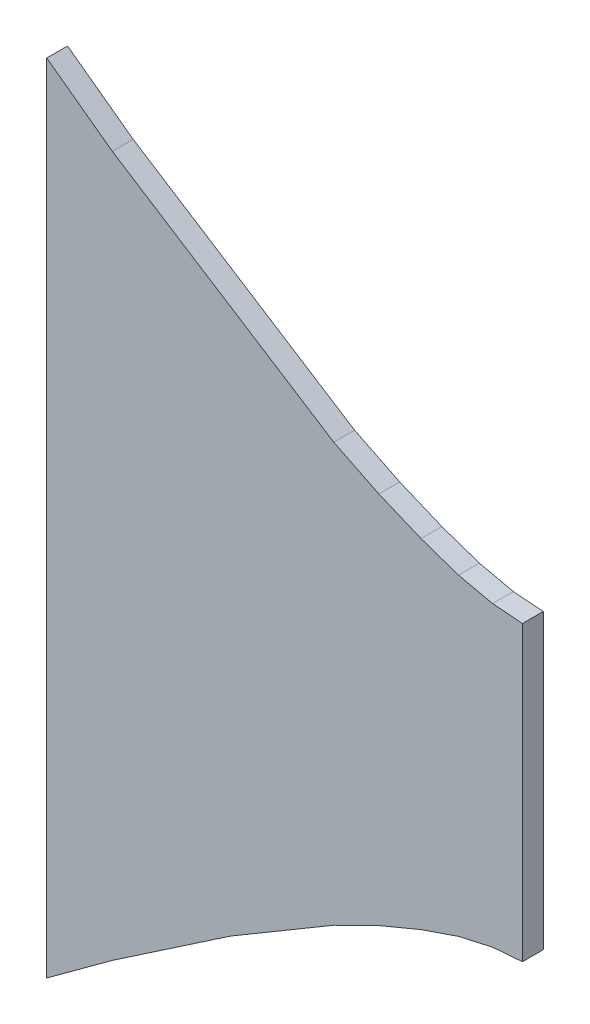
ISO-10303-21;
HEADER;
FILE_DESCRIPTION(('STEP AP214'),'2;1');
FILE_NAME('part.step','',(''),(''),'','','');
FILE_SCHEMA(('AUTOMOTIVE_DESIGN { 1 0 10303 214 1 1 1 1 }'));
ENDSEC;
DATA;
#1=APPLICATION_CONTEXT('core data for automotive mechanical design processes');
#2=APPLICATION_PROTOCOL_DEFINITION('international standard','automotive_design',2000,#1);
#3=PRODUCT_CONTEXT('',#1,'mechanical');
#4=PRODUCT('Part','Part','',(#3));
#5=PRODUCT_RELATED_PRODUCT_CATEGORY('part','',(#4));
#6=PRODUCT_DEFINITION_FORMATION('','',#4);
#7=PRODUCT_DEFINITION_CONTEXT('part definition',#1,'design');
#8=PRODUCT_DEFINITION('design','',#6,#7);
#9=PRODUCT_DEFINITION_SHAPE('','',#8);
#10=(LENGTH_UNIT() NAMED_UNIT(*) SI_UNIT(.MILLI.,.METRE.));
#11=(NAMED_UNIT(*) PLANE_ANGLE_UNIT() SI_UNIT($,.RADIAN.));
#12=(NAMED_UNIT(*) SI_UNIT($,.STERADIAN.) SOLID_ANGLE_UNIT());
#13=UNCERTAINTY_MEASURE_WITH_UNIT(LENGTH_MEASURE(1.E-05),#10,'distance_accuracy_value','');
#14=(GEOMETRIC_REPRESENTATION_CONTEXT(3) GLOBAL_UNCERTAINTY_ASSIGNED_CONTEXT((#13)) GLOBAL_UNIT_ASSIGNED_CONTEXT((#10,
#11,#12)) REPRESENTATION_CONTEXT('',''));
#15=CARTESIAN_POINT('',(0.,0.,0.));
#16=DIRECTION('',(0.,0.,1.));
#17=DIRECTION('',(1.,0.,0.));
#18=AXIS2_PLACEMENT_3D('',#15,#16,#17);
#19=CARTESIAN_POINT('',(82.681999206543,117.25,0.));
#20=DIRECTION('',(-0.0781447450221444,-0.996942023803503,0.));
#21=DIRECTION('',(-0.996942023803503,0.0781447450221444,0.));
#22=AXIS2_PLACEMENT_3D('',#19,#20,#21);
#23=PLANE('',#22);
#24=DIRECTION('',(-0.996942023803503,0.0781447450221444,0.));
#25=VECTOR('',#24,1.);
#26=CARTESIAN_POINT('',(82.681999206543,117.25,0.03556));
#27=LINE('',#26,#25);
#28=CARTESIAN_POINT('',(82.681999206543,117.25,0.03556));
#29=VERTEX_POINT('',#28);
#30=CARTESIAN_POINT('',(82.6309967041016,117.253997802734,0.03556));
#31=VERTEX_POINT('',#30);
#32=EDGE_CURVE('E11',#29,#31,#27,.T.);
#33=ORIENTED_EDGE('',*,*,#32,.F.);
#34=DIRECTION('',(0.,0.,1.));
#35=VECTOR('',#34,1.);
#36=CARTESIAN_POINT('',(82.681999206543,117.25,0.));
#37=LINE('',#36,#35);
#38=CARTESIAN_POINT('',(82.681999206543,117.25,0.));
#39=VERTEX_POINT('',#38);
#40=EDGE_CURVE('E24',#39,#29,#37,.T.);
#41=ORIENTED_EDGE('',*,*,#40,.F.);
#42=DIRECTION('',(-0.996942023803503,0.0781447450221444,0.));
#43=VECTOR('',#42,1.);
#44=CARTESIAN_POINT('',(82.681999206543,117.25,0.));
#45=LINE('',#44,#43);
#46=CARTESIAN_POINT('',(82.6309967041016,117.253997802734,0.));
#47=VERTEX_POINT('',#46);
#48=EDGE_CURVE('E154',#39,#47,#45,.T.);
#49=ORIENTED_EDGE('',*,*,#48,.T.);
#50=DIRECTION('',(0.,0.,1.));
#51=VECTOR('',#50,1.);
#52=CARTESIAN_POINT('',(82.6309967041016,117.253997802734,0.));
#53=LINE('',#52,#51);
#54=EDGE_CURVE('E37',#47,#31,#53,.T.);
#55=ORIENTED_EDGE('',*,*,#54,.T.);
#56=EDGE_LOOP('',(#33,#41,#49,#55));
#57=FACE_BOUND('',#56,.T.);
#58=ADVANCED_FACE('F17',(#57),#23,.F.);
#59=CARTESIAN_POINT('',(82.6309967041016,117.253997802734,0.));
#60=DIRECTION('',(-0.218724100263412,-0.97578674307656,0.));
#61=DIRECTION('',(-0.97578674307656,0.218724100263412,0.));
#62=AXIS2_PLACEMENT_3D('',#59,#60,#61);
#63=PLANE('',#62);
#64=DIRECTION('',(-0.97578674307656,0.218724100263412,0.));
#65=VECTOR('',#64,1.);
#66=CARTESIAN_POINT('',(82.6309967041016,117.253997802734,0.03556));
#67=LINE('',#66,#65);
#68=CARTESIAN_POINT('',(82.572998046875,117.266998291016,0.03556));
#69=VERTEX_POINT('',#68);
#70=EDGE_CURVE('E266',#31,#69,#67,.T.);
#71=ORIENTED_EDGE('',*,*,#70,.F.);
#72=ORIENTED_EDGE('',*,*,#54,.F.);
#73=DIRECTION('',(-0.97578674307656,0.218724100263412,0.));
#74=VECTOR('',#73,1.);
#75=CARTESIAN_POINT('',(82.6309967041016,117.253997802734,0.));
#76=LINE('',#75,#74);
#77=CARTESIAN_POINT('',(82.572998046875,117.266998291016,0.));
#78=VERTEX_POINT('',#77);
#79=EDGE_CURVE('E263',#47,#78,#76,.T.);
#80=ORIENTED_EDGE('',*,*,#79,.T.);
#81=DIRECTION('',(0.,0.,1.));
#82=VECTOR('',#81,1.);
#83=CARTESIAN_POINT('',(82.572998046875,117.266998291016,0.));
#84=LINE('',#83,#82);
#85=EDGE_CURVE('E261',#78,#69,#84,.T.);
#86=ORIENTED_EDGE('',*,*,#85,.T.);
#87=EDGE_LOOP('',(#71,#72,#80,#86));
#88=FACE_BOUND('',#87,.T.);
#89=ADVANCED_FACE('F274',(#88),#63,.F.);
#90=CARTESIAN_POINT('',(82.572998046875,117.266998291016,0.));
#91=DIRECTION('',(-0.325142784154832,-0.945664935329657,0.));
#92=DIRECTION('',(-0.945664935329657,0.325142784154832,0.));
#93=AXIS2_PLACEMENT_3D('',#90,#91,#92);
#94=PLANE('',#93);
#95=DIRECTION('',(-0.945664935329657,0.325142784154832,0.));
#96=VECTOR('',#95,1.);
#97=CARTESIAN_POINT('',(82.572998046875,117.266998291016,0.03556));
#98=LINE('',#97,#96);
#99=CARTESIAN_POINT('',(82.5090026855469,117.289001464844,0.03556));
#100=VERTEX_POINT('',#99);
#101=EDGE_CURVE('E258',#69,#100,#98,.T.);
#102=ORIENTED_EDGE('',*,*,#101,.F.);
#103=ORIENTED_EDGE('',*,*,#85,.F.);
#104=DIRECTION('',(-0.945664935329657,0.325142784154832,0.));
#105=VECTOR('',#104,1.);
#106=CARTESIAN_POINT('',(82.572998046875,117.266998291016,0.));
#107=LINE('',#106,#105);
#108=CARTESIAN_POINT('',(82.5090026855469,117.289001464844,0.));
#109=VERTEX_POINT('',#108);
#110=EDGE_CURVE('E255',#78,#109,#107,.T.);
#111=ORIENTED_EDGE('',*,*,#110,.T.);
#112=DIRECTION('',(0.,0.,1.));
#113=VECTOR('',#112,1.);
#114=CARTESIAN_POINT('',(82.5090026855469,117.289001464844,0.));
#115=LINE('',#114,#113);
#116=EDGE_CURVE('E253',#109,#100,#115,.T.);
#117=ORIENTED_EDGE('',*,*,#116,.T.);
#118=EDGE_LOOP('',(#102,#103,#111,#117));
#119=FACE_BOUND('',#118,.T.);
#120=ADVANCED_FACE('F280',(#119),#94,.F.);
#121=CARTESIAN_POINT('',(82.5090026855469,117.289001464844,0.));
#122=DIRECTION('',(-0.384573715338406,-0.923094284171891,0.));
#123=DIRECTION('',(-0.923094284171891,0.384573715338406,0.));
#124=AXIS2_PLACEMENT_3D('',#121,#122,#123);
#125=PLANE('',#124);
#126=DIRECTION('',(-0.923094284171891,0.384573715338406,0.));
#127=VECTOR('',#126,1.);
#128=CARTESIAN_POINT('',(82.5090026855469,117.289001464844,0.03556));
#129=LINE('',#128,#127);
#130=CARTESIAN_POINT('',(82.4369964599609,117.319000244141,0.03556));
#131=VERTEX_POINT('',#130);
#132=EDGE_CURVE('E250',#100,#131,#129,.T.);
#133=ORIENTED_EDGE('',*,*,#132,.F.);
#134=ORIENTED_EDGE('',*,*,#116,.F.);
#135=DIRECTION('',(-0.923094284171891,0.384573715338406,0.));
#136=VECTOR('',#135,1.);
#137=CARTESIAN_POINT('',(82.5090026855469,117.289001464844,0.));
#138=LINE('',#137,#136);
#139=CARTESIAN_POINT('',(82.4369964599609,117.319000244141,0.));
#140=VERTEX_POINT('',#139);
#141=EDGE_CURVE('E247',#109,#140,#138,.T.);
#142=ORIENTED_EDGE('',*,*,#141,.T.);
#143=DIRECTION('',(0.,0.,1.));
#144=VECTOR('',#143,1.);
#145=CARTESIAN_POINT('',(82.4369964599609,117.319000244141,0.));
#146=LINE('',#145,#144);
#147=EDGE_CURVE('E245',#140,#131,#146,.T.);
#148=ORIENTED_EDGE('',*,*,#147,.T.);
#149=EDGE_LOOP('',(#133,#134,#142,#148));
#150=FACE_BOUND('',#149,.T.);
#151=ADVANCED_FACE('F282',(#150),#125,.F.);
#152=CARTESIAN_POINT('',(82.4369964599609,117.319000244141,0.));
#153=DIRECTION('',(-0.442587164049526,-0.896725488774908,0.));
#154=DIRECTION('',(-0.896725488774908,0.442587164049526,0.));
#155=AXIS2_PLACEMENT_3D('',#152,#153,#154);
#156=PLANE('',#155);
#157=DIRECTION('',(-0.896725488774908,0.442587164049526,0.));
#158=VECTOR('',#157,1.);
#159=CARTESIAN_POINT('',(82.4369964599609,117.319000244141,0.03556));
#160=LINE('',#159,#158);
#161=CARTESIAN_POINT('',(82.3600006103516,117.357002258301,0.03556));
#162=VERTEX_POINT('',#161);
#163=EDGE_CURVE('E242',#131,#162,#160,.T.);
#164=ORIENTED_EDGE('',*,*,#163,.F.);
#165=ORIENTED_EDGE('',*,*,#147,.F.);
#166=DIRECTION('',(-0.896725488774908,0.442587164049526,0.));
#167=VECTOR('',#166,1.);
#168=CARTESIAN_POINT('',(82.4369964599609,117.319000244141,0.));
#169=LINE('',#168,#167);
#170=CARTESIAN_POINT('',(82.3600006103516,117.357002258301,0.));
#171=VERTEX_POINT('',#170);
#172=EDGE_CURVE('E239',#140,#171,#169,.T.);
#173=ORIENTED_EDGE('',*,*,#172,.T.);
#174=DIRECTION('',(0.,0.,1.));
#175=VECTOR('',#174,1.);
#176=CARTESIAN_POINT('',(82.3600006103516,117.357002258301,0.));
#177=LINE('',#176,#175);
#178=EDGE_CURVE('E237',#171,#162,#177,.T.);
#179=ORIENTED_EDGE('',*,*,#178,.T.);
#180=EDGE_LOOP('',(#164,#165,#173,#179));
#181=FACE_BOUND('',#180,.T.);
#182=ADVANCED_FACE('F287',(#181),#156,.F.);
#183=CARTESIAN_POINT('',(82.3600006103516,117.357002258301,0.));
#184=DIRECTION('',(-0.537594397602345,-0.843203571900981,0.));
#185=DIRECTION('',(-0.843203571900981,0.537594397602345,0.));
#186=AXIS2_PLACEMENT_3D('',#183,#184,#185);
#187=PLANE('',#186);
#188=DIRECTION('',(-0.843203571900981,0.537594397602345,0.));
#189=VECTOR('',#188,1.);
#190=CARTESIAN_POINT('',(82.3600006103516,117.357002258301,0.03556));
#191=LINE('',#190,#189);
#192=CARTESIAN_POINT('',(81.9820022583008,117.597999572754,0.03556));
#193=VERTEX_POINT('',#192);
#194=EDGE_CURVE('E234',#162,#193,#191,.T.);
#195=ORIENTED_EDGE('',*,*,#194,.F.);
#196=ORIENTED_EDGE('',*,*,#178,.F.);
#197=DIRECTION('',(-0.843203571900981,0.537594397602345,0.));
#198=VECTOR('',#197,1.);
#199=CARTESIAN_POINT('',(82.3600006103516,117.357002258301,0.));
#200=LINE('',#199,#198);
#201=CARTESIAN_POINT('',(81.9820022583008,117.597999572754,0.));
#202=VERTEX_POINT('',#201);
#203=EDGE_CURVE('E231',#171,#202,#200,.T.);
#204=ORIENTED_EDGE('',*,*,#203,.T.);
#205=DIRECTION('',(0.,0.,1.));
#206=VECTOR('',#205,1.);
#207=CARTESIAN_POINT('',(81.9820022583008,117.597999572754,0.));
#208=LINE('',#207,#206);
#209=EDGE_CURVE('E229',#202,#193,#208,.T.);
#210=ORIENTED_EDGE('',*,*,#209,.T.);
#211=EDGE_LOOP('',(#195,#196,#204,#210));
#212=FACE_BOUND('',#211,.T.);
#213=ADVANCED_FACE('F290',(#212),#187,.F.);
#214=CARTESIAN_POINT('',(81.9820022583008,117.597999572754,0.));
#215=DIRECTION('',(-0.590743962247607,-0.806859077576746,0.));
#216=DIRECTION('',(-0.806859077576746,0.590743962247607,0.));
#217=AXIS2_PLACEMENT_3D('',#214,#215,#216);
#218=PLANE('',#217);
#219=DIRECTION('',(-0.806859077576746,0.590743962247607,0.));
#220=VECTOR('',#219,1.);
#221=CARTESIAN_POINT('',(81.9820022583008,117.597999572754,0.03556));
#222=LINE('',#221,#220);
#223=CARTESIAN_POINT('',(81.870002746582,117.680000305176,0.03556));
#224=VERTEX_POINT('',#223);
#225=EDGE_CURVE('E226',#193,#224,#222,.T.);
#226=ORIENTED_EDGE('',*,*,#225,.F.);
#227=ORIENTED_EDGE('',*,*,#209,.F.);
#228=DIRECTION('',(-0.806859077576746,0.590743962247607,0.));
#229=VECTOR('',#228,1.);
#230=CARTESIAN_POINT('',(81.9820022583008,117.597999572754,0.));
#231=LINE('',#230,#229);
#232=CARTESIAN_POINT('',(81.870002746582,117.680000305176,0.));
#233=VERTEX_POINT('',#232);
#234=EDGE_CURVE('E223',#202,#233,#231,.T.);
#235=ORIENTED_EDGE('',*,*,#234,.T.);
#236=DIRECTION('',(0.,0.,1.));
#237=VECTOR('',#236,1.);
#238=CARTESIAN_POINT('',(81.870002746582,117.680000305176,0.));
#239=LINE('',#238,#237);
#240=EDGE_CURVE('E221',#233,#224,#239,.T.);
#241=ORIENTED_EDGE('',*,*,#240,.T.);
#242=EDGE_LOOP('',(#226,#227,#235,#241));
#243=FACE_BOUND('',#242,.T.);
#244=ADVANCED_FACE('F295',(#243),#218,.F.);
#245=CARTESIAN_POINT('',(81.870002746582,117.680000305176,0.));
#246=DIRECTION('',(1.,0.,0.));
#247=DIRECTION('',(0.,-1.,0.));
#248=AXIS2_PLACEMENT_3D('',#245,#246,#247);
#249=PLANE('',#248);
#250=DIRECTION('',(0.,-1.,0.));
#251=VECTOR('',#250,1.);
#252=CARTESIAN_POINT('',(81.870002746582,117.680000305176,0.03556));
#253=LINE('',#252,#251);
#254=CARTESIAN_POINT('',(81.870002746582,116.319999694824,0.03556));
#255=VERTEX_POINT('',#254);
#256=EDGE_CURVE('E218',#224,#255,#253,.T.);
#257=ORIENTED_EDGE('',*,*,#256,.F.);
#258=ORIENTED_EDGE('',*,*,#240,.F.);
#259=DIRECTION('',(0.,-1.,0.));
#260=VECTOR('',#259,1.);
#261=CARTESIAN_POINT('',(81.870002746582,117.680000305176,0.));
#262=LINE('',#261,#260);
#263=CARTESIAN_POINT('',(81.870002746582,116.319999694824,0.));
#264=VERTEX_POINT('',#263);
#265=EDGE_CURVE('E215',#233,#264,#262,.T.);
#266=ORIENTED_EDGE('',*,*,#265,.T.);
#267=DIRECTION('',(0.,0.,1.));
#268=VECTOR('',#267,1.);
#269=CARTESIAN_POINT('',(81.870002746582,116.319999694824,0.));
#270=LINE('',#269,#268);
#271=EDGE_CURVE('E213',#264,#255,#270,.T.);
#272=ORIENTED_EDGE('',*,*,#271,.T.);
#273=EDGE_LOOP('',(#257,#258,#266,#272));
#274=FACE_BOUND('',#273,.T.);
#275=ADVANCED_FACE('F298',(#274),#249,.F.);
#276=CARTESIAN_POINT('',(81.870002746582,116.319999694824,0.));
#277=DIRECTION('',(-0.590743962247607,0.806859077576746,0.));
#278=DIRECTION('',(0.806859077576746,0.590743962247607,0.));
#279=AXIS2_PLACEMENT_3D('',#276,#277,#278);
#280=PLANE('',#279);
#281=DIRECTION('',(0.806859077576746,0.590743962247607,0.));
#282=VECTOR('',#281,1.);
#283=CARTESIAN_POINT('',(81.870002746582,116.319999694824,0.03556));
#284=LINE('',#283,#282);
#285=CARTESIAN_POINT('',(81.9820022583008,116.402000427246,0.03556));
#286=VERTEX_POINT('',#285);
#287=EDGE_CURVE('E210',#255,#286,#284,.T.);
#288=ORIENTED_EDGE('',*,*,#287,.F.);
#289=ORIENTED_EDGE('',*,*,#271,.F.);
#290=DIRECTION('',(0.806859077576746,0.590743962247607,0.));
#291=VECTOR('',#290,1.);
#292=CARTESIAN_POINT('',(81.870002746582,116.319999694824,0.));
#293=LINE('',#292,#291);
#294=CARTESIAN_POINT('',(81.9820022583008,116.402000427246,0.));
#295=VERTEX_POINT('',#294);
#296=EDGE_CURVE('E207',#264,#295,#293,.T.);
#297=ORIENTED_EDGE('',*,*,#296,.T.);
#298=DIRECTION('',(0.,0.,1.));
#299=VECTOR('',#298,1.);
#300=CARTESIAN_POINT('',(81.9820022583008,116.402000427246,0.));
#301=LINE('',#300,#299);
#302=EDGE_CURVE('E205',#295,#286,#301,.T.);
#303=ORIENTED_EDGE('',*,*,#302,.T.);
#304=EDGE_LOOP('',(#288,#289,#297,#303));
#305=FACE_BOUND('',#304,.T.);
#306=ADVANCED_FACE('F303',(#305),#280,.F.);
#307=CARTESIAN_POINT('',(81.9820022583008,116.402000427246,0.));
#308=DIRECTION('',(-0.561311831406684,0.827604390951905,0.));
#309=DIRECTION('',(0.827604390951905,0.561311831406684,0.));
#310=AXIS2_PLACEMENT_3D('',#307,#308,#309);
#311=PLANE('',#310);
#312=DIRECTION('',(0.827604390951905,0.561311831406684,0.));
#313=VECTOR('',#312,1.);
#314=CARTESIAN_POINT('',(81.9820022583008,116.402000427246,0.03556));
#315=LINE('',#314,#313);
#316=CARTESIAN_POINT('',(82.1839981079102,116.539001464844,0.03556));
#317=VERTEX_POINT('',#316);
#318=EDGE_CURVE('E202',#286,#317,#315,.T.);
#319=ORIENTED_EDGE('',*,*,#318,.F.);
#320=ORIENTED_EDGE('',*,*,#302,.F.);
#321=DIRECTION('',(0.827604390951905,0.561311831406684,0.));
#322=VECTOR('',#321,1.);
#323=CARTESIAN_POINT('',(81.9820022583008,116.402000427246,0.));
#324=LINE('',#323,#322);
#325=CARTESIAN_POINT('',(82.1839981079102,116.539001464844,0.));
#326=VERTEX_POINT('',#325);
#327=EDGE_CURVE('E199',#295,#326,#324,.T.);
#328=ORIENTED_EDGE('',*,*,#327,.T.);
#329=DIRECTION('',(0.,0.,1.));
#330=VECTOR('',#329,1.);
#331=CARTESIAN_POINT('',(82.1839981079102,116.539001464844,0.));
#332=LINE('',#331,#330);
#333=EDGE_CURVE('E197',#326,#317,#332,.T.);
#334=ORIENTED_EDGE('',*,*,#333,.T.);
#335=EDGE_LOOP('',(#319,#320,#328,#334));
#336=FACE_BOUND('',#335,.T.);
#337=ADVANCED_FACE('F306',(#336),#311,.F.);
#338=CARTESIAN_POINT('',(82.1839981079102,116.539001464844,0.));
#339=DIRECTION('',(-0.508710451917148,0.860937672604848,0.));
#340=DIRECTION('',(0.860937672604848,0.508710451917148,0.));
#341=AXIS2_PLACEMENT_3D('',#338,#339,#340);
#342=PLANE('',#341);
#343=DIRECTION('',(0.860937672604848,0.508710451917148,0.));
#344=VECTOR('',#343,1.);
#345=CARTESIAN_POINT('',(82.1839981079102,116.539001464844,0.03556));
#346=LINE('',#345,#344);
#347=CARTESIAN_POINT('',(82.3600006103516,116.642997741699,0.03556));
#348=VERTEX_POINT('',#347);
#349=EDGE_CURVE('E194',#317,#348,#346,.T.);
#350=ORIENTED_EDGE('',*,*,#349,.F.);
#351=ORIENTED_EDGE('',*,*,#333,.F.);
#352=DIRECTION('',(0.860937672604848,0.508710451917148,0.));
#353=VECTOR('',#352,1.);
#354=CARTESIAN_POINT('',(82.1839981079102,116.539001464844,0.));
#355=LINE('',#354,#353);
#356=CARTESIAN_POINT('',(82.3600006103516,116.642997741699,0.));
#357=VERTEX_POINT('',#356);
#358=EDGE_CURVE('E191',#326,#357,#355,.T.);
#359=ORIENTED_EDGE('',*,*,#358,.T.);
#360=DIRECTION('',(0.,0.,1.));
#361=VECTOR('',#360,1.);
#362=CARTESIAN_POINT('',(82.3600006103516,116.642997741699,0.));
#363=LINE('',#362,#361);
#364=EDGE_CURVE('E189',#357,#348,#363,.T.);
#365=ORIENTED_EDGE('',*,*,#364,.T.);
#366=EDGE_LOOP('',(#350,#351,#359,#365));
#367=FACE_BOUND('',#366,.T.);
#368=ADVANCED_FACE('F311',(#367),#342,.F.);
#369=CARTESIAN_POINT('',(82.3600006103516,116.642997741699,0.));
#370=DIRECTION('',(-0.442587164049526,0.896725488774908,0.));
#371=DIRECTION('',(0.896725488774908,0.442587164049526,0.));
#372=AXIS2_PLACEMENT_3D('',#369,#370,#371);
#373=PLANE('',#372);
#374=DIRECTION('',(0.896725488774908,0.442587164049526,0.));
#375=VECTOR('',#374,1.);
#376=CARTESIAN_POINT('',(82.3600006103516,116.642997741699,0.03556));
#377=LINE('',#376,#375);
#378=CARTESIAN_POINT('',(82.4369964599609,116.680999755859,0.03556));
#379=VERTEX_POINT('',#378);
#380=EDGE_CURVE('E186',#348,#379,#377,.T.);
#381=ORIENTED_EDGE('',*,*,#380,.F.);
#382=ORIENTED_EDGE('',*,*,#364,.F.);
#383=DIRECTION('',(0.896725488774908,0.442587164049526,0.));
#384=VECTOR('',#383,1.);
#385=CARTESIAN_POINT('',(82.3600006103516,116.642997741699,0.));
#386=LINE('',#385,#384);
#387=CARTESIAN_POINT('',(82.4369964599609,116.680999755859,0.));
#388=VERTEX_POINT('',#387);
#389=EDGE_CURVE('E183',#357,#388,#386,.T.);
#390=ORIENTED_EDGE('',*,*,#389,.T.);
#391=DIRECTION('',(0.,0.,1.));
#392=VECTOR('',#391,1.);
#393=CARTESIAN_POINT('',(82.4369964599609,116.680999755859,0.));
#394=LINE('',#393,#392);
#395=EDGE_CURVE('E181',#388,#379,#394,.T.);
#396=ORIENTED_EDGE('',*,*,#395,.T.);
#397=EDGE_LOOP('',(#381,#382,#390,#396));
#398=FACE_BOUND('',#397,.T.);
#399=ADVANCED_FACE('F314',(#398),#373,.F.);
#400=CARTESIAN_POINT('',(82.4369964599609,116.680999755859,0.));
#401=DIRECTION('',(-0.384573715338406,0.923094284171891,0.));
#402=DIRECTION('',(0.923094284171891,0.384573715338406,0.));
#403=AXIS2_PLACEMENT_3D('',#400,#401,#402);
#404=PLANE('',#403);
#405=DIRECTION('',(0.923094284171891,0.384573715338406,0.));
#406=VECTOR('',#405,1.);
#407=CARTESIAN_POINT('',(82.4369964599609,116.680999755859,0.03556));
#408=LINE('',#407,#406);
#409=CARTESIAN_POINT('',(82.5090026855469,116.710998535156,0.03556));
#410=VERTEX_POINT('',#409);
#411=EDGE_CURVE('E178',#379,#410,#408,.T.);
#412=ORIENTED_EDGE('',*,*,#411,.F.);
#413=ORIENTED_EDGE('',*,*,#395,.F.);
#414=DIRECTION('',(0.923094284171891,0.384573715338406,0.));
#415=VECTOR('',#414,1.);
#416=CARTESIAN_POINT('',(82.4369964599609,116.680999755859,0.));
#417=LINE('',#416,#415);
#418=CARTESIAN_POINT('',(82.5090026855469,116.710998535156,0.));
#419=VERTEX_POINT('',#418);
#420=EDGE_CURVE('E175',#388,#419,#417,.T.);
#421=ORIENTED_EDGE('',*,*,#420,.T.);
#422=DIRECTION('',(0.,0.,1.));
#423=VECTOR('',#422,1.);
#424=CARTESIAN_POINT('',(82.5090026855469,116.710998535156,0.));
#425=LINE('',#424,#423);
#426=EDGE_CURVE('E173',#419,#410,#425,.T.);
#427=ORIENTED_EDGE('',*,*,#426,.T.);
#428=EDGE_LOOP('',(#412,#413,#421,#427));
#429=FACE_BOUND('',#428,.T.);
#430=ADVANCED_FACE('F319',(#429),#404,.F.);
#431=CARTESIAN_POINT('',(82.5090026855469,116.710998535156,0.));
#432=DIRECTION('',(-0.325142784154832,0.945664935329657,0.));
#433=DIRECTION('',(0.945664935329657,0.325142784154832,0.));
#434=AXIS2_PLACEMENT_3D('',#431,#432,#433);
#435=PLANE('',#434);
#436=DIRECTION('',(0.945664935329657,0.325142784154832,0.));
#437=VECTOR('',#436,1.);
#438=CARTESIAN_POINT('',(82.5090026855469,116.710998535156,0.03556));
#439=LINE('',#438,#437);
#440=CARTESIAN_POINT('',(82.572998046875,116.733001708984,0.03556));
#441=VERTEX_POINT('',#440);
#442=EDGE_CURVE('E170',#410,#441,#439,.T.);
#443=ORIENTED_EDGE('',*,*,#442,.F.);
#444=ORIENTED_EDGE('',*,*,#426,.F.);
#445=DIRECTION('',(0.945664935329657,0.325142784154832,0.));
#446=VECTOR('',#445,1.);
#447=CARTESIAN_POINT('',(82.5090026855469,116.710998535156,0.));
#448=LINE('',#447,#446);
#449=CARTESIAN_POINT('',(82.572998046875,116.733001708984,0.));
#450=VERTEX_POINT('',#449);
#451=EDGE_CURVE('E167',#419,#450,#448,.T.);
#452=ORIENTED_EDGE('',*,*,#451,.T.);
#453=DIRECTION('',(0.,0.,1.));
#454=VECTOR('',#453,1.);
#455=CARTESIAN_POINT('',(82.572998046875,116.733001708984,0.));
#456=LINE('',#455,#454);
#457=EDGE_CURVE('E165',#450,#441,#456,.T.);
#458=ORIENTED_EDGE('',*,*,#457,.T.);
#459=EDGE_LOOP('',(#443,#444,#452,#458));
#460=FACE_BOUND('',#459,.T.);
#461=ADVANCED_FACE('F322',(#460),#435,.F.);
#462=CARTESIAN_POINT('',(82.572998046875,116.733001708984,0.));
#463=DIRECTION('',(-0.218724100263412,0.97578674307656,0.));
#464=DIRECTION('',(0.97578674307656,0.218724100263412,0.));
#465=AXIS2_PLACEMENT_3D('',#462,#463,#464);
#466=PLANE('',#465);
#467=DIRECTION('',(0.97578674307656,0.218724100263412,0.));
#468=VECTOR('',#467,1.);
#469=CARTESIAN_POINT('',(82.572998046875,116.733001708984,0.03556));
#470=LINE('',#469,#468);
#471=CARTESIAN_POINT('',(82.6309967041016,116.746002197266,0.03556));
#472=VERTEX_POINT('',#471);
#473=EDGE_CURVE('E162',#441,#472,#470,.T.);
#474=ORIENTED_EDGE('',*,*,#473,.F.);
#475=ORIENTED_EDGE('',*,*,#457,.F.);
#476=DIRECTION('',(0.97578674307656,0.218724100263412,0.));
#477=VECTOR('',#476,1.);
#478=CARTESIAN_POINT('',(82.572998046875,116.733001708984,0.));
#479=LINE('',#478,#477);
#480=CARTESIAN_POINT('',(82.6309967041016,116.746002197266,0.));
#481=VERTEX_POINT('',#480);
#482=EDGE_CURVE('E160',#450,#481,#479,.T.);
#483=ORIENTED_EDGE('',*,*,#482,.T.);
#484=DIRECTION('',(0.,0.,1.));
#485=VECTOR('',#484,1.);
#486=CARTESIAN_POINT('',(82.6309967041016,116.746002197266,0.));
#487=LINE('',#486,#485);
#488=EDGE_CURVE('E145',#481,#472,#487,.T.);
#489=ORIENTED_EDGE('',*,*,#488,.T.);
#490=EDGE_LOOP('',(#474,#475,#483,#489));
#491=FACE_BOUND('',#490,.T.);
#492=ADVANCED_FACE('F325',(#491),#466,.F.);
#493=CARTESIAN_POINT('',(82.6309967041016,116.746002197266,0.));
#494=DIRECTION('',(-0.0781447450221444,0.996942023803503,0.));
#495=DIRECTION('',(0.996942023803503,0.0781447450221444,0.));
#496=AXIS2_PLACEMENT_3D('',#493,#494,#495);
#497=PLANE('',#496);
#498=DIRECTION('',(0.996942023803503,0.0781447450221444,0.));
#499=VECTOR('',#498,1.);
#500=CARTESIAN_POINT('',(82.6309967041016,116.746002197266,0.03556));
#501=LINE('',#500,#499);
#502=CARTESIAN_POINT('',(82.681999206543,116.75,0.03556));
#503=VERTEX_POINT('',#502);
#504=EDGE_CURVE('E149',#472,#503,#501,.T.);
#505=ORIENTED_EDGE('',*,*,#504,.F.);
#506=ORIENTED_EDGE('',*,*,#488,.F.);
#507=DIRECTION('',(0.996942023803503,0.0781447450221444,0.));
#508=VECTOR('',#507,1.);
#509=CARTESIAN_POINT('',(82.6309967041016,116.746002197266,0.));
#510=LINE('',#509,#508);
#511=CARTESIAN_POINT('',(82.681999206543,116.75,0.));
#512=VERTEX_POINT('',#511);
#513=EDGE_CURVE('E141',#481,#512,#510,.T.);
#514=ORIENTED_EDGE('',*,*,#513,.T.);
#515=DIRECTION('',(0.,0.,1.));
#516=VECTOR('',#515,1.);
#517=CARTESIAN_POINT('',(82.681999206543,116.75,0.));
#518=LINE('',#517,#516);
#519=EDGE_CURVE('E131',#512,#503,#518,.T.);
#520=ORIENTED_EDGE('',*,*,#519,.T.);
#521=EDGE_LOOP('',(#505,#506,#514,#520));
#522=FACE_BOUND('',#521,.T.);
#523=ADVANCED_FACE('F144',(#522),#497,.F.);
#524=CARTESIAN_POINT('',(82.681999206543,116.75,0.));
#525=DIRECTION('',(-1.,0.,0.));
#526=DIRECTION('',(0.,1.,0.));
#527=AXIS2_PLACEMENT_3D('',#524,#525,#526);
#528=PLANE('',#527);
#529=DIRECTION('',(0.,1.,0.));
#530=VECTOR('',#529,1.);
#531=CARTESIAN_POINT('',(82.681999206543,116.75,0.03556));
#532=LINE('',#531,#530);
#533=EDGE_CURVE('E137',#503,#29,#532,.T.);
#534=ORIENTED_EDGE('',*,*,#533,.F.);
#535=ORIENTED_EDGE('',*,*,#519,.F.);
#536=DIRECTION('',(0.,1.,0.));
#537=VECTOR('',#536,1.);
#538=CARTESIAN_POINT('',(82.681999206543,116.75,0.));
#539=LINE('',#538,#537);
#540=EDGE_CURVE('E135',#512,#39,#539,.T.);
#541=ORIENTED_EDGE('',*,*,#540,.T.);
#542=ORIENTED_EDGE('',*,*,#40,.T.);
#543=EDGE_LOOP('',(#534,#535,#541,#542));
#544=FACE_BOUND('',#543,.T.);
#545=ADVANCED_FACE('F133',(#544),#528,.F.);
#546=CARTESIAN_POINT('',(82.681999206543,117.25,0.));
#547=DIRECTION('',(0.,0.,1.));
#548=DIRECTION('',(1.,0.,0.));
#549=AXIS2_PLACEMENT_3D('',#546,#547,#548);
#550=PLANE('',#549);
#551=ORIENTED_EDGE('',*,*,#540,.F.);
#552=ORIENTED_EDGE('',*,*,#513,.F.);
#553=ORIENTED_EDGE('',*,*,#482,.F.);
#554=ORIENTED_EDGE('',*,*,#451,.F.);
#555=ORIENTED_EDGE('',*,*,#420,.F.);
#556=ORIENTED_EDGE('',*,*,#389,.F.);
#557=ORIENTED_EDGE('',*,*,#358,.F.);
#558=ORIENTED_EDGE('',*,*,#327,.F.);
#559=ORIENTED_EDGE('',*,*,#296,.F.);
#560=ORIENTED_EDGE('',*,*,#265,.F.);
#561=ORIENTED_EDGE('',*,*,#234,.F.);
#562=ORIENTED_EDGE('',*,*,#203,.F.);
#563=ORIENTED_EDGE('',*,*,#172,.F.);
#564=ORIENTED_EDGE('',*,*,#141,.F.);
#565=ORIENTED_EDGE('',*,*,#110,.F.);
#566=ORIENTED_EDGE('',*,*,#79,.F.);
#567=ORIENTED_EDGE('',*,*,#48,.F.);
#568=EDGE_LOOP('',(#551,#552,#553,#554,#555,#556,#557,#558,#559,#560,#561,#562,#563,#564,#565,
#566,#567));
#569=FACE_BOUND('',#568,.T.);
#570=ADVANCED_FACE('F152',(#569),#550,.F.);
#571=CARTESIAN_POINT('',(82.681999206543,117.25,0.03556));
#572=DIRECTION('',(0.,0.,1.));
#573=DIRECTION('',(1.,0.,0.));
#574=AXIS2_PLACEMENT_3D('',#571,#572,#573);
#575=PLANE('',#574);
#576=ORIENTED_EDGE('',*,*,#32,.T.);
#577=ORIENTED_EDGE('',*,*,#70,.T.);
#578=ORIENTED_EDGE('',*,*,#101,.T.);
#579=ORIENTED_EDGE('',*,*,#132,.T.);
#580=ORIENTED_EDGE('',*,*,#163,.T.);
#581=ORIENTED_EDGE('',*,*,#194,.T.);
#582=ORIENTED_EDGE('',*,*,#225,.T.);
#583=ORIENTED_EDGE('',*,*,#256,.T.);
#584=ORIENTED_EDGE('',*,*,#287,.T.);
#585=ORIENTED_EDGE('',*,*,#318,.T.);
#586=ORIENTED_EDGE('',*,*,#349,.T.);
#587=ORIENTED_EDGE('',*,*,#380,.T.);
#588=ORIENTED_EDGE('',*,*,#411,.T.);
#589=ORIENTED_EDGE('',*,*,#442,.T.);
#590=ORIENTED_EDGE('',*,*,#473,.T.);
#591=ORIENTED_EDGE('',*,*,#504,.T.);
#592=ORIENTED_EDGE('',*,*,#533,.T.);
#593=EDGE_LOOP('',(#576,#577,#578,#579,#580,#581,#582,#583,#584,#585,#586,#587,#588,#589,#590,
#591,#592));
#594=FACE_BOUND('',#593,.T.);
#595=ADVANCED_FACE('F277',(#594),#575,.T.);
#596=CLOSED_SHELL('',(#58,#89,#120,#151,#182,#213,#244,#275,#306,#337,#368,#399,#430,#461,#492,
#523,#545,#570,#595));
#597=MANIFOLD_SOLID_BREP('B1',#596);
#598=ADVANCED_BREP_SHAPE_REPRESENTATION('',(#18,#597),#14);
#599=SHAPE_DEFINITION_REPRESENTATION(#9,#598);
ENDSEC;
END-ISO-10303-21;
